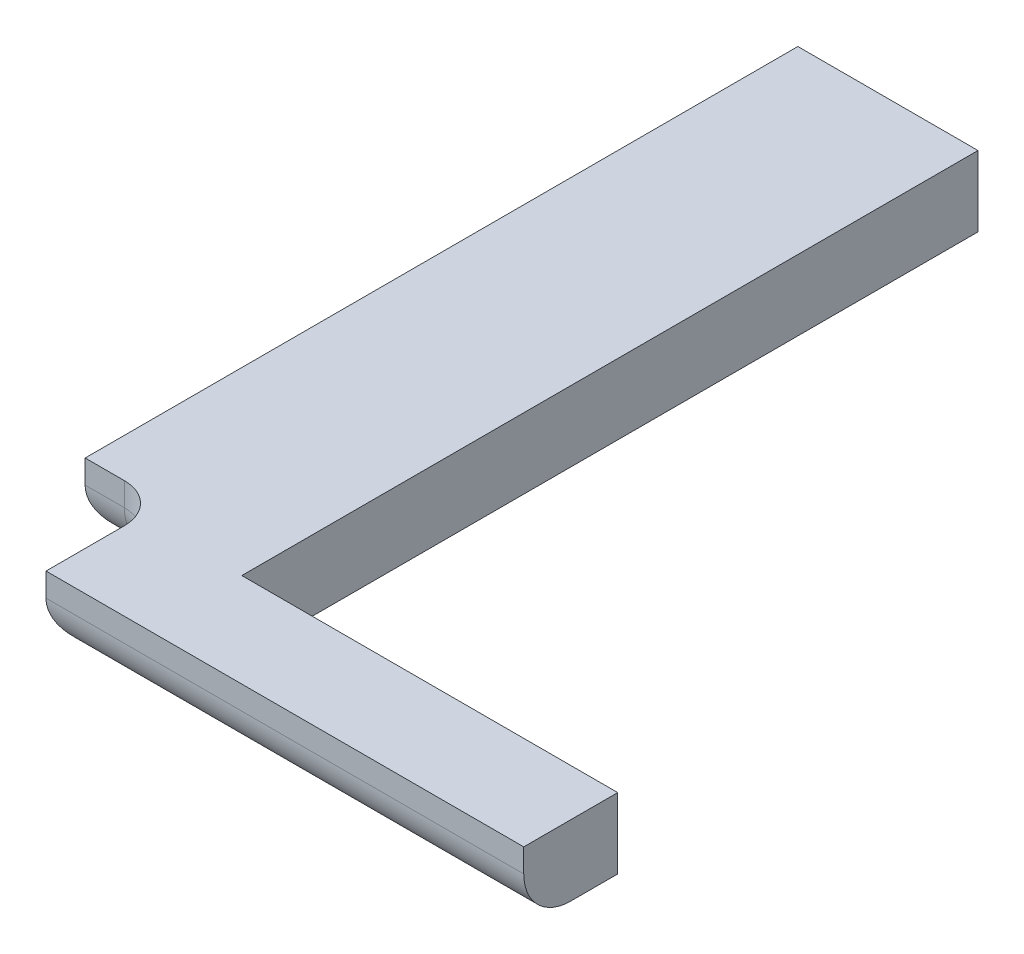
ISO-10303-21;
HEADER;
FILE_DESCRIPTION(('STEP AP214'),'2;1');
FILE_NAME('part.step','',(''),(''),'','','');
FILE_SCHEMA(('AUTOMOTIVE_DESIGN { 1 0 10303 214 1 1 1 1 }'));
ENDSEC;
DATA;
#1=APPLICATION_CONTEXT('core data for automotive mechanical design processes');
#2=APPLICATION_PROTOCOL_DEFINITION('international standard','automotive_design',2000,#1);
#3=PRODUCT_CONTEXT('',#1,'mechanical');
#4=PRODUCT('Part','Part','',(#3));
#5=PRODUCT_RELATED_PRODUCT_CATEGORY('part','',(#4));
#6=PRODUCT_DEFINITION_FORMATION('','',#4);
#7=PRODUCT_DEFINITION_CONTEXT('part definition',#1,'design');
#8=PRODUCT_DEFINITION('design','',#6,#7);
#9=PRODUCT_DEFINITION_SHAPE('','',#8);
#10=(LENGTH_UNIT() NAMED_UNIT(*) SI_UNIT(.MILLI.,.METRE.));
#11=(NAMED_UNIT(*) PLANE_ANGLE_UNIT() SI_UNIT($,.RADIAN.));
#12=(NAMED_UNIT(*) SI_UNIT($,.STERADIAN.) SOLID_ANGLE_UNIT());
#13=UNCERTAINTY_MEASURE_WITH_UNIT(LENGTH_MEASURE(1.E-05),#10,'distance_accuracy_value','');
#14=(GEOMETRIC_REPRESENTATION_CONTEXT(3) GLOBAL_UNCERTAINTY_ASSIGNED_CONTEXT((#13)) GLOBAL_UNIT_ASSIGNED_CONTEXT((#10,
#11,#12)) REPRESENTATION_CONTEXT('',''));
#15=CARTESIAN_POINT('',(0.,0.,0.));
#16=DIRECTION('',(0.,0.,1.));
#17=DIRECTION('',(1.,0.,0.));
#18=AXIS2_PLACEMENT_3D('',#15,#16,#17);
#19=CARTESIAN_POINT('',(0.,9.,12.));
#20=DIRECTION('',(-1.,0.,0.));
#21=DIRECTION('',(0.,0.,1.));
#22=AXIS2_PLACEMENT_3D('',#19,#20,#21);
#23=PLANE('',#22);
#24=DIRECTION('',(0.,-1.,0.));
#25=VECTOR('',#24,1.);
#26=CARTESIAN_POINT('',(0.,9.,12.));
#27=LINE('',#26,#25);
#28=CARTESIAN_POINT('',(0.,9.,12.));
#29=VERTEX_POINT('',#28);
#30=CARTESIAN_POINT('',(0.,6.,12.));
#31=VERTEX_POINT('',#30);
#32=EDGE_CURVE('E265',#29,#31,#27,.T.);
#33=ORIENTED_EDGE('',*,*,#32,.T.);
#34=CARTESIAN_POINT('',(0.,6.,6.));
#35=DIRECTION('',(-1.,0.,0.));
#36=DIRECTION('',(0.,0.,1.));
#37=AXIS2_PLACEMENT_3D('',#34,#35,#36);
#38=CIRCLE('',#37,6.);
#39=CARTESIAN_POINT('',(0.,0.,6.));
#40=VERTEX_POINT('',#39);
#41=EDGE_CURVE('E146',#31,#40,#38,.F.);
#42=ORIENTED_EDGE('',*,*,#41,.T.);
#43=DIRECTION('',(0.,0.,-1.));
#44=VECTOR('',#43,1.);
#45=CARTESIAN_POINT('',(0.,0.,12.));
#46=LINE('',#45,#44);
#47=CARTESIAN_POINT('',(0.,0.,0.));
#48=VERTEX_POINT('',#47);
#49=EDGE_CURVE('E141',#40,#48,#46,.T.);
#50=ORIENTED_EDGE('',*,*,#49,.T.);
#51=DIRECTION('',(0.,-1.,0.));
#52=VECTOR('',#51,1.);
#53=CARTESIAN_POINT('',(0.,9.,0.));
#54=LINE('',#53,#52);
#55=CARTESIAN_POINT('',(0.,9.,0.));
#56=VERTEX_POINT('',#55);
#57=EDGE_CURVE('E123',#56,#48,#54,.T.);
#58=ORIENTED_EDGE('',*,*,#57,.F.);
#59=DIRECTION('',(0.,0.,-1.));
#60=VECTOR('',#59,1.);
#61=CARTESIAN_POINT('',(0.,9.,12.));
#62=LINE('',#61,#60);
#63=EDGE_CURVE('E129',#29,#56,#62,.T.);
#64=ORIENTED_EDGE('',*,*,#63,.F.);
#65=EDGE_LOOP('',(#33,#42,#50,#58,#64));
#66=FACE_BOUND('',#65,.T.);
#67=ADVANCED_FACE('F33',(#66),#23,.F.);
#68=CARTESIAN_POINT('',(0.,9.,0.));
#69=DIRECTION('',(0.,0.,1.));
#70=DIRECTION('',(1.,0.,0.));
#71=AXIS2_PLACEMENT_3D('',#68,#69,#70);
#72=PLANE('',#71);
#73=DIRECTION('',(-1.,0.,0.));
#74=VECTOR('',#73,1.);
#75=CARTESIAN_POINT('',(0.,0.,0.));
#76=LINE('',#75,#74);
#77=CARTESIAN_POINT('',(-48.,0.,0.));
#78=VERTEX_POINT('',#77);
#79=EDGE_CURVE('E261',#48,#78,#76,.T.);
#80=ORIENTED_EDGE('',*,*,#79,.T.);
#81=DIRECTION('',(0.,-1.,0.));
#82=VECTOR('',#81,1.);
#83=CARTESIAN_POINT('',(-48.,9.,0.));
#84=LINE('',#83,#82);
#85=CARTESIAN_POINT('',(-48.,9.,0.));
#86=VERTEX_POINT('',#85);
#87=EDGE_CURVE('E125',#86,#78,#84,.T.);
#88=ORIENTED_EDGE('',*,*,#87,.F.);
#89=DIRECTION('',(-1.,0.,0.));
#90=VECTOR('',#89,1.);
#91=CARTESIAN_POINT('',(0.,9.,0.));
#92=LINE('',#91,#90);
#93=EDGE_CURVE('E119',#56,#86,#92,.T.);
#94=ORIENTED_EDGE('',*,*,#93,.F.);
#95=ORIENTED_EDGE('',*,*,#57,.T.);
#96=EDGE_LOOP('',(#80,#88,#94,#95));
#97=FACE_BOUND('',#96,.T.);
#98=ADVANCED_FACE('F121',(#97),#72,.F.);
#99=CARTESIAN_POINT('',(-48.,9.,0.));
#100=DIRECTION('',(-1.,0.,0.));
#101=DIRECTION('',(0.,0.,1.));
#102=AXIS2_PLACEMENT_3D('',#99,#100,#101);
#103=PLANE('',#102);
#104=DIRECTION('',(0.,0.,-1.));
#105=VECTOR('',#104,1.);
#106=CARTESIAN_POINT('',(-48.,0.,0.));
#107=LINE('',#106,#105);
#108=CARTESIAN_POINT('',(-48.,0.,-94.));
#109=VERTEX_POINT('',#108);
#110=EDGE_CURVE('E259',#78,#109,#107,.T.);
#111=ORIENTED_EDGE('',*,*,#110,.T.);
#112=DIRECTION('',(0.,-1.,0.));
#113=VECTOR('',#112,1.);
#114=CARTESIAN_POINT('',(-48.,9.,-94.));
#115=LINE('',#114,#113);
#116=CARTESIAN_POINT('',(-48.,9.,-94.));
#117=VERTEX_POINT('',#116);
#118=EDGE_CURVE('E148',#117,#109,#115,.T.);
#119=ORIENTED_EDGE('',*,*,#118,.F.);
#120=DIRECTION('',(0.,0.,-1.));
#121=VECTOR('',#120,1.);
#122=CARTESIAN_POINT('',(-48.,9.,0.));
#123=LINE('',#122,#121);
#124=EDGE_CURVE('E128',#86,#117,#123,.T.);
#125=ORIENTED_EDGE('',*,*,#124,.F.);
#126=ORIENTED_EDGE('',*,*,#87,.T.);
#127=EDGE_LOOP('',(#111,#119,#125,#126));
#128=FACE_BOUND('',#127,.T.);
#129=ADVANCED_FACE('F205',(#128),#103,.F.);
#130=CARTESIAN_POINT('',(-48.,9.,-94.));
#131=DIRECTION('',(0.,0.,1.));
#132=DIRECTION('',(1.,0.,0.));
#133=AXIS2_PLACEMENT_3D('',#130,#131,#132);
#134=PLANE('',#133);
#135=DIRECTION('',(-1.,0.,0.));
#136=VECTOR('',#135,1.);
#137=CARTESIAN_POINT('',(-48.,0.,-94.));
#138=LINE('',#137,#136);
#139=CARTESIAN_POINT('',(-65.,0.,-94.));
#140=VERTEX_POINT('',#139);
#141=EDGE_CURVE('E138',#109,#140,#138,.T.);
#142=ORIENTED_EDGE('',*,*,#141,.T.);
#143=CARTESIAN_POINT('',(-65.,6.,-94.));
#144=DIRECTION('',(0.,0.,1.));
#145=DIRECTION('',(1.,0.,0.));
#146=AXIS2_PLACEMENT_3D('',#143,#144,#145);
#147=CIRCLE('',#146,6.);
#148=CARTESIAN_POINT('',(-71.,6.,-94.));
#149=VERTEX_POINT('',#148);
#150=EDGE_CURVE('E11',#140,#149,#147,.F.);
#151=ORIENTED_EDGE('',*,*,#150,.T.);
#152=DIRECTION('',(0.,-1.,0.));
#153=VECTOR('',#152,1.);
#154=CARTESIAN_POINT('',(-71.,9.,-94.));
#155=LINE('',#154,#153);
#156=CARTESIAN_POINT('',(-71.,9.,-94.));
#157=VERTEX_POINT('',#156);
#158=EDGE_CURVE('E240',#157,#149,#155,.T.);
#159=ORIENTED_EDGE('',*,*,#158,.F.);
#160=DIRECTION('',(-1.,0.,0.));
#161=VECTOR('',#160,1.);
#162=CARTESIAN_POINT('',(-48.,9.,-94.));
#163=LINE('',#162,#161);
#164=EDGE_CURVE('E256',#117,#157,#163,.T.);
#165=ORIENTED_EDGE('',*,*,#164,.F.);
#166=ORIENTED_EDGE('',*,*,#118,.T.);
#167=EDGE_LOOP('',(#142,#151,#159,#165,#166));
#168=FACE_BOUND('',#167,.T.);
#169=ADVANCED_FACE('F255',(#168),#134,.F.);
#170=CARTESIAN_POINT('',(-71.,9.,-94.));
#171=DIRECTION('',(1.,0.,0.));
#172=DIRECTION('',(0.,0.,-1.));
#173=AXIS2_PLACEMENT_3D('',#170,#171,#172);
#174=PLANE('',#173);
#175=ORIENTED_EDGE('',*,*,#158,.T.);
#176=DIRECTION('',(0.,0.,1.));
#177=VECTOR('',#176,1.);
#178=CARTESIAN_POINT('',(-71.,6.,-3.));
#179=LINE('',#178,#177);
#180=CARTESIAN_POINT('',(-71.,6.,-3.));
#181=VERTEX_POINT('',#180);
#182=EDGE_CURVE('E43',#149,#181,#179,.T.);
#183=ORIENTED_EDGE('',*,*,#182,.T.);
#184=DIRECTION('',(0.,-1.,0.));
#185=VECTOR('',#184,1.);
#186=CARTESIAN_POINT('',(-71.,9.,-3.));
#187=LINE('',#186,#185);
#188=CARTESIAN_POINT('',(-71.,9.,-3.));
#189=VERTEX_POINT('',#188);
#190=EDGE_CURVE('E238',#189,#181,#187,.T.);
#191=ORIENTED_EDGE('',*,*,#190,.F.);
#192=DIRECTION('',(0.,0.,1.));
#193=VECTOR('',#192,1.);
#194=CARTESIAN_POINT('',(-71.,9.,-94.));
#195=LINE('',#194,#193);
#196=EDGE_CURVE('E287',#157,#189,#195,.T.);
#197=ORIENTED_EDGE('',*,*,#196,.F.);
#198=EDGE_LOOP('',(#175,#183,#191,#197));
#199=FACE_BOUND('',#198,.T.);
#200=ADVANCED_FACE('F236',(#199),#174,.F.);
#201=CARTESIAN_POINT('',(-71.,9.,-3.));
#202=DIRECTION('',(0.,0.,-1.));
#203=DIRECTION('',(-1.,0.,0.));
#204=AXIS2_PLACEMENT_3D('',#201,#202,#203);
#205=PLANE('',#204);
#206=ORIENTED_EDGE('',*,*,#190,.T.);
#207=DIRECTION('',(1.,0.,0.));
#208=VECTOR('',#207,1.);
#209=CARTESIAN_POINT('',(-61.,6.,-3.));
#210=LINE('',#209,#208);
#211=CARTESIAN_POINT('',(-66.,6.,-3.));
#212=VERTEX_POINT('',#211);
#213=EDGE_CURVE('E163',#181,#212,#210,.T.);
#214=ORIENTED_EDGE('',*,*,#213,.T.);
#215=DIRECTION('',(0.,-1.,0.));
#216=VECTOR('',#215,1.);
#217=CARTESIAN_POINT('',(-66.,9.,-3.));
#218=LINE('',#217,#216);
#219=CARTESIAN_POINT('',(-66.,9.,-3.));
#220=VERTEX_POINT('',#219);
#221=EDGE_CURVE('E246',#220,#212,#218,.T.);
#222=ORIENTED_EDGE('',*,*,#221,.F.);
#223=DIRECTION('',(1.,0.,0.));
#224=VECTOR('',#223,1.);
#225=CARTESIAN_POINT('',(-71.,9.,-3.));
#226=LINE('',#225,#224);
#227=EDGE_CURVE('E245',#189,#220,#226,.T.);
#228=ORIENTED_EDGE('',*,*,#227,.F.);
#229=EDGE_LOOP('',(#206,#214,#222,#228));
#230=FACE_BOUND('',#229,.T.);
#231=ADVANCED_FACE('F242',(#230),#205,.F.);
#232=CARTESIAN_POINT('',(-66.,9.,2.));
#233=DIRECTION('',(0.,-1.,0.));
#234=DIRECTION('',(0.,0.,-1.));
#235=AXIS2_PLACEMENT_3D('',#232,#233,#234);
#236=CYLINDRICAL_SURFACE('',#235,5.);
#237=ORIENTED_EDGE('',*,*,#221,.T.);
#238=CARTESIAN_POINT('',(-66.,6.,2.));
#239=DIRECTION('',(0.,-1.,0.));
#240=DIRECTION('',(0.,0.,-1.));
#241=AXIS2_PLACEMENT_3D('',#238,#239,#240);
#242=CIRCLE('',#241,5.);
#243=CARTESIAN_POINT('',(-61.,6.,2.));
#244=VERTEX_POINT('',#243);
#245=EDGE_CURVE('E165',#212,#244,#242,.T.);
#246=ORIENTED_EDGE('',*,*,#245,.T.);
#247=DIRECTION('',(0.,-1.,0.));
#248=VECTOR('',#247,1.);
#249=CARTESIAN_POINT('',(-61.,9.,2.));
#250=LINE('',#249,#248);
#251=CARTESIAN_POINT('',(-61.,9.,2.));
#252=VERTEX_POINT('',#251);
#253=EDGE_CURVE('E249',#252,#244,#250,.T.);
#254=ORIENTED_EDGE('',*,*,#253,.F.);
#255=CARTESIAN_POINT('',(-66.,9.,2.));
#256=DIRECTION('',(0.,-1.,0.));
#257=DIRECTION('',(0.,0.,-1.));
#258=AXIS2_PLACEMENT_3D('',#255,#256,#257);
#259=CIRCLE('',#258,5.);
#260=EDGE_CURVE('E279',#220,#252,#259,.T.);
#261=ORIENTED_EDGE('',*,*,#260,.F.);
#262=EDGE_LOOP('',(#237,#246,#254,#261));
#263=FACE_BOUND('',#262,.T.);
#264=ADVANCED_FACE('F278',(#263),#236,.F.);
#265=CARTESIAN_POINT('',(-61.,9.,2.));
#266=DIRECTION('',(1.,0.,0.));
#267=DIRECTION('',(0.,0.,-1.));
#268=AXIS2_PLACEMENT_3D('',#265,#266,#267);
#269=PLANE('',#268);
#270=ORIENTED_EDGE('',*,*,#253,.T.);
#271=DIRECTION('',(0.,0.,1.));
#272=VECTOR('',#271,1.);
#273=CARTESIAN_POINT('',(-61.,6.,12.));
#274=LINE('',#273,#272);
#275=CARTESIAN_POINT('',(-61.,6.,12.));
#276=VERTEX_POINT('',#275);
#277=EDGE_CURVE('E161',#244,#276,#274,.T.);
#278=ORIENTED_EDGE('',*,*,#277,.T.);
#279=DIRECTION('',(0.,-1.,0.));
#280=VECTOR('',#279,1.);
#281=CARTESIAN_POINT('',(-61.,9.,12.));
#282=LINE('',#281,#280);
#283=CARTESIAN_POINT('',(-61.,9.,12.));
#284=VERTEX_POINT('',#283);
#285=EDGE_CURVE('E267',#284,#276,#282,.T.);
#286=ORIENTED_EDGE('',*,*,#285,.F.);
#287=DIRECTION('',(0.,0.,1.));
#288=VECTOR('',#287,1.);
#289=CARTESIAN_POINT('',(-61.,9.,2.));
#290=LINE('',#289,#288);
#291=EDGE_CURVE('E275',#252,#284,#290,.T.);
#292=ORIENTED_EDGE('',*,*,#291,.F.);
#293=EDGE_LOOP('',(#270,#278,#286,#292));
#294=FACE_BOUND('',#293,.T.);
#295=ADVANCED_FACE('F273',(#294),#269,.F.);
#296=CARTESIAN_POINT('',(-61.,9.,12.));
#297=DIRECTION('',(0.,0.,-1.));
#298=DIRECTION('',(-1.,0.,0.));
#299=AXIS2_PLACEMENT_3D('',#296,#297,#298);
#300=PLANE('',#299);
#301=ORIENTED_EDGE('',*,*,#285,.T.);
#302=DIRECTION('',(1.,0.,0.));
#303=VECTOR('',#302,1.);
#304=CARTESIAN_POINT('',(0.,6.,12.));
#305=LINE('',#304,#303);
#306=EDGE_CURVE('E143',#276,#31,#305,.T.);
#307=ORIENTED_EDGE('',*,*,#306,.T.);
#308=ORIENTED_EDGE('',*,*,#32,.F.);
#309=DIRECTION('',(1.,0.,0.));
#310=VECTOR('',#309,1.);
#311=CARTESIAN_POINT('',(-61.,9.,12.));
#312=LINE('',#311,#310);
#313=EDGE_CURVE('E134',#284,#29,#312,.T.);
#314=ORIENTED_EDGE('',*,*,#313,.F.);
#315=EDGE_LOOP('',(#301,#307,#308,#314));
#316=FACE_BOUND('',#315,.T.);
#317=ADVANCED_FACE('F325',(#316),#300,.F.);
#318=CARTESIAN_POINT('',(-66.,9.,2.));
#319=DIRECTION('',(0.,-1.,0.));
#320=DIRECTION('',(0.,0.,-1.));
#321=AXIS2_PLACEMENT_3D('',#318,#319,#320);
#322=PLANE('',#321);
#323=ORIENTED_EDGE('',*,*,#63,.T.);
#324=ORIENTED_EDGE('',*,*,#93,.T.);
#325=ORIENTED_EDGE('',*,*,#124,.T.);
#326=ORIENTED_EDGE('',*,*,#164,.T.);
#327=ORIENTED_EDGE('',*,*,#196,.T.);
#328=ORIENTED_EDGE('',*,*,#227,.T.);
#329=ORIENTED_EDGE('',*,*,#260,.T.);
#330=ORIENTED_EDGE('',*,*,#291,.T.);
#331=ORIENTED_EDGE('',*,*,#313,.T.);
#332=EDGE_LOOP('',(#323,#324,#325,#326,#327,#328,#329,#330,#331));
#333=FACE_BOUND('',#332,.T.);
#334=ADVANCED_FACE('F132',(#333),#322,.F.);
#335=CARTESIAN_POINT('',(-66.,0.,2.));
#336=DIRECTION('',(0.,-1.,0.));
#337=DIRECTION('',(0.,0.,-1.));
#338=AXIS2_PLACEMENT_3D('',#335,#336,#337);
#339=PLANE('',#338);
#340=CARTESIAN_POINT('',(-56.,0.,-84.));
#341=DIRECTION('',(0.,-1.,0.));
#342=DIRECTION('',(0.,0.,-1.));
#343=AXIS2_PLACEMENT_3D('',#340,#341,#342);
#344=CIRCLE('',#343,6.);
#345=CARTESIAN_POINT('',(-56.,0.,-90.));
#346=VERTEX_POINT('',#345);
#347=EDGE_CURVE('E297',#346,#346,#344,.T.);
#348=ORIENTED_EDGE('',*,*,#347,.F.);
#349=EDGE_LOOP('',(#348));
#350=FACE_BOUND('',#349,.T.);
#351=CARTESIAN_POINT('',(-56.,0.,-64.));
#352=DIRECTION('',(0.,-1.,0.));
#353=DIRECTION('',(0.,0.,-1.));
#354=AXIS2_PLACEMENT_3D('',#351,#352,#353);
#355=CIRCLE('',#354,6.);
#356=CARTESIAN_POINT('',(-56.,0.,-70.));
#357=VERTEX_POINT('',#356);
#358=EDGE_CURVE('E291',#357,#357,#355,.T.);
#359=ORIENTED_EDGE('',*,*,#358,.F.);
#360=EDGE_LOOP('',(#359));
#361=FACE_BOUND('',#360,.T.);
#362=ORIENTED_EDGE('',*,*,#49,.F.);
#363=DIRECTION('',(1.,0.,0.));
#364=VECTOR('',#363,1.);
#365=CARTESIAN_POINT('',(-61.,0.,6.));
#366=LINE('',#365,#364);
#367=CARTESIAN_POINT('',(-55.,0.,6.));
#368=VERTEX_POINT('',#367);
#369=EDGE_CURVE('E159',#40,#368,#366,.F.);
#370=ORIENTED_EDGE('',*,*,#369,.T.);
#371=DIRECTION('',(0.,0.,1.));
#372=VECTOR('',#371,1.);
#373=CARTESIAN_POINT('',(-55.,0.,2.));
#374=LINE('',#373,#372);
#375=CARTESIAN_POINT('',(-55.,0.,2.));
#376=VERTEX_POINT('',#375);
#377=EDGE_CURVE('E157',#368,#376,#374,.F.);
#378=ORIENTED_EDGE('',*,*,#377,.T.);
#379=CARTESIAN_POINT('',(-66.,0.,2.));
#380=DIRECTION('',(0.,-1.,0.));
#381=DIRECTION('',(0.,0.,-1.));
#382=AXIS2_PLACEMENT_3D('',#379,#380,#381);
#383=CIRCLE('',#382,11.);
#384=CARTESIAN_POINT('',(-65.,0.,-8.95445115010332));
#385=VERTEX_POINT('',#384);
#386=EDGE_CURVE('E155',#376,#385,#383,.F.);
#387=ORIENTED_EDGE('',*,*,#386,.T.);
#388=DIRECTION('',(0.,0.,1.));
#389=VECTOR('',#388,1.);
#390=CARTESIAN_POINT('',(-65.,0.,-94.));
#391=LINE('',#390,#389);
#392=EDGE_CURVE('E153',#385,#140,#391,.F.);
#393=ORIENTED_EDGE('',*,*,#392,.T.);
#394=ORIENTED_EDGE('',*,*,#141,.F.);
#395=ORIENTED_EDGE('',*,*,#110,.F.);
#396=ORIENTED_EDGE('',*,*,#79,.F.);
#397=EDGE_LOOP('',(#362,#370,#378,#387,#393,#394,#395,#396));
#398=FACE_BOUND('',#397,.T.);
#399=ADVANCED_FACE('F189',(#350,#361,#398),#339,.T.);
#400=CARTESIAN_POINT('',(-65.,6.,-94.));
#401=DIRECTION('',(0.,0.,-1.));
#402=DIRECTION('',(-1.,0.,0.));
#403=AXIS2_PLACEMENT_3D('',#400,#401,#402);
#404=CYLINDRICAL_SURFACE('',#403,6.);
#405=CARTESIAN_POINT('',(-65.,6.,-9.));
#406=DIRECTION('',(-0.707106781186548,0.,-0.707106781186547));
#407=DIRECTION('',(0.707106781186547,0.,-0.707106781186548));
#408=AXIS2_PLACEMENT_3D('',#405,#406,#407);
#409=ELLIPSE('',#408,8.48528137423857,6.);
#410=CARTESIAN_POINT('',(-66.,0.0839202169003843,-7.99999999999999));
#411=VERTEX_POINT('',#410);
#412=EDGE_CURVE('E37',#181,#411,#409,.F.);
#413=ORIENTED_EDGE('',*,*,#412,.F.);
#414=ORIENTED_EDGE('',*,*,#182,.F.);
#415=ORIENTED_EDGE('',*,*,#150,.F.);
#416=ORIENTED_EDGE('',*,*,#392,.F.);
#417=CARTESIAN_POINT('',(-66.,0.0839202169003843,-7.99999999999999));
#418=CARTESIAN_POINT('',(-65.7312956317891,0.0385069745095071,-8.26872735809804));
#419=CARTESIAN_POINT('',(-65.4557879465511,0.0107629331039343,-8.53336412427679));
#420=CARTESIAN_POINT('',(-65.1209081882709,0.000970955422316308,-8.84363310663395));
#421=CARTESIAN_POINT('',(-65.066271378058,0.000115654360453228,-8.89390106239372));
#422=CARTESIAN_POINT('',(-65.0076427144854,3.65187896827806E-06,-8.9474726721671));
#423=CARTESIAN_POINT('',(-65.003821772076,4.29184426437478E-10,-8.95096236612994));
#424=CARTESIAN_POINT('',(-65.,0.,-8.95445115010332));
#425=B_SPLINE_CURVE_WITH_KNOTS('',3,(#417,#418,#419,#420,#421,#422,#423,#424),.UNSPECIFIED.,.F.,
.F.,(4,2,2,4),(0.,1.14707936905922,1.36980975958521,1.38533387176109),.UNSPECIFIED.);
#426=EDGE_CURVE('E177',#411,#385,#425,.T.);
#427=ORIENTED_EDGE('',*,*,#426,.F.);
#428=EDGE_LOOP('',(#413,#414,#415,#416,#427));
#429=FACE_BOUND('',#428,.T.);
#430=ADVANCED_FACE('F186',(#429),#404,.T.);
#431=CARTESIAN_POINT('',(-71.,6.,-9.));
#432=DIRECTION('',(-1.,0.,0.));
#433=DIRECTION('',(0.,0.,1.));
#434=AXIS2_PLACEMENT_3D('',#431,#432,#433);
#435=CYLINDRICAL_SURFACE('',#434,6.);
#436=ORIENTED_EDGE('',*,*,#213,.F.);
#437=ORIENTED_EDGE('',*,*,#412,.T.);
#438=CARTESIAN_POINT('',(-66.,6.,-9.));
#439=DIRECTION('',(1.,0.,0.));
#440=DIRECTION('',(0.,0.,-1.));
#441=AXIS2_PLACEMENT_3D('',#438,#439,#440);
#442=CIRCLE('',#441,6.);
#443=EDGE_CURVE('E175',#212,#411,#442,.T.);
#444=ORIENTED_EDGE('',*,*,#443,.F.);
#445=EDGE_LOOP('',(#436,#437,#444));
#446=FACE_BOUND('',#445,.T.);
#447=ADVANCED_FACE('F35',(#446),#435,.T.);
#448=CARTESIAN_POINT('',(-66.,6.,2.));
#449=DIRECTION('',(0.,-1.,0.));
#450=DIRECTION('',(0.,0.,-1.));
#451=AXIS2_PLACEMENT_3D('',#448,#449,#450);
#452=TOROIDAL_SURFACE('',#451,11.,6.);
#453=ORIENTED_EDGE('',*,*,#426,.T.);
#454=ORIENTED_EDGE('',*,*,#386,.F.);
#455=CARTESIAN_POINT('',(-55.,6.,2.));
#456=DIRECTION('',(0.,0.,1.));
#457=DIRECTION('',(1.,0.,0.));
#458=AXIS2_PLACEMENT_3D('',#455,#456,#457);
#459=CIRCLE('',#458,6.);
#460=EDGE_CURVE('E171',#244,#376,#459,.T.);
#461=ORIENTED_EDGE('',*,*,#460,.F.);
#462=ORIENTED_EDGE('',*,*,#245,.F.);
#463=ORIENTED_EDGE('',*,*,#443,.T.);
#464=EDGE_LOOP('',(#453,#454,#461,#462,#463));
#465=FACE_BOUND('',#464,.T.);
#466=ADVANCED_FACE('F183',(#465),#452,.T.);
#467=CARTESIAN_POINT('',(-55.,6.,2.));
#468=DIRECTION('',(0.,0.,-1.));
#469=DIRECTION('',(-1.,0.,0.));
#470=AXIS2_PLACEMENT_3D('',#467,#468,#469);
#471=CYLINDRICAL_SURFACE('',#470,6.);
#472=ORIENTED_EDGE('',*,*,#460,.T.);
#473=ORIENTED_EDGE('',*,*,#377,.F.);
#474=CARTESIAN_POINT('',(-55.,6.,6.));
#475=DIRECTION('',(-0.707106781186547,0.,-0.707106781186547));
#476=DIRECTION('',(0.707106781186547,0.,-0.707106781186547));
#477=AXIS2_PLACEMENT_3D('',#474,#475,#476);
#478=ELLIPSE('',#477,8.48528137423857,6.);
#479=EDGE_CURVE('E168',#276,#368,#478,.F.);
#480=ORIENTED_EDGE('',*,*,#479,.F.);
#481=ORIENTED_EDGE('',*,*,#277,.F.);
#482=EDGE_LOOP('',(#472,#473,#480,#481));
#483=FACE_BOUND('',#482,.T.);
#484=ADVANCED_FACE('F212',(#483),#471,.T.);
#485=CARTESIAN_POINT('',(-61.,6.,6.));
#486=DIRECTION('',(-1.,0.,0.));
#487=DIRECTION('',(0.,0.,1.));
#488=AXIS2_PLACEMENT_3D('',#485,#486,#487);
#489=CYLINDRICAL_SURFACE('',#488,6.);
#490=ORIENTED_EDGE('',*,*,#479,.T.);
#491=ORIENTED_EDGE('',*,*,#369,.F.);
#492=ORIENTED_EDGE('',*,*,#41,.F.);
#493=ORIENTED_EDGE('',*,*,#306,.F.);
#494=EDGE_LOOP('',(#490,#491,#492,#493));
#495=FACE_BOUND('',#494,.T.);
#496=ADVANCED_FACE('F209',(#495),#489,.T.);
#497=CARTESIAN_POINT('',(-56.,3.,-64.));
#498=DIRECTION('',(0.,-1.,0.));
#499=DIRECTION('',(0.,0.,-1.));
#500=AXIS2_PLACEMENT_3D('',#497,#498,#499);
#501=CYLINDRICAL_SURFACE('',#500,6.);
#502=CARTESIAN_POINT('',(-56.,3.,-64.));
#503=DIRECTION('',(0.,-1.,0.));
#504=DIRECTION('',(0.,0.,-1.));
#505=AXIS2_PLACEMENT_3D('',#502,#503,#504);
#506=CIRCLE('',#505,6.);
#507=CARTESIAN_POINT('',(-56.,3.,-70.));
#508=VERTEX_POINT('',#507);
#509=EDGE_CURVE('E294',#508,#508,#506,.T.);
#510=ORIENTED_EDGE('',*,*,#509,.F.);
#511=EDGE_LOOP('',(#510));
#512=FACE_BOUND('',#511,.T.);
#513=ORIENTED_EDGE('',*,*,#358,.T.);
#514=EDGE_LOOP('',(#513));
#515=FACE_BOUND('',#514,.T.);
#516=ADVANCED_FACE('F211',(#512,#515),#501,.F.);
#517=CARTESIAN_POINT('',(-56.,3.,-64.));
#518=DIRECTION('',(0.,-1.,0.));
#519=DIRECTION('',(0.,0.,-1.));
#520=AXIS2_PLACEMENT_3D('',#517,#518,#519);
#521=PLANE('',#520);
#522=ORIENTED_EDGE('',*,*,#509,.T.);
#523=EDGE_LOOP('',(#522));
#524=FACE_BOUND('',#523,.T.);
#525=ADVANCED_FACE('F308',(#524),#521,.T.);
#526=CARTESIAN_POINT('',(-56.,3.,-84.));
#527=DIRECTION('',(0.,-1.,0.));
#528=DIRECTION('',(0.,0.,-1.));
#529=AXIS2_PLACEMENT_3D('',#526,#527,#528);
#530=CYLINDRICAL_SURFACE('',#529,6.);
#531=CARTESIAN_POINT('',(-56.,3.,-84.));
#532=DIRECTION('',(0.,-1.,0.));
#533=DIRECTION('',(0.,0.,-1.));
#534=AXIS2_PLACEMENT_3D('',#531,#532,#533);
#535=CIRCLE('',#534,6.);
#536=CARTESIAN_POINT('',(-56.,3.,-90.));
#537=VERTEX_POINT('',#536);
#538=EDGE_CURVE('E172',#537,#537,#535,.T.);
#539=ORIENTED_EDGE('',*,*,#538,.F.);
#540=EDGE_LOOP('',(#539));
#541=FACE_BOUND('',#540,.T.);
#542=ORIENTED_EDGE('',*,*,#347,.T.);
#543=EDGE_LOOP('',(#542));
#544=FACE_BOUND('',#543,.T.);
#545=ADVANCED_FACE('F305',(#541,#544),#530,.F.);
#546=CARTESIAN_POINT('',(-56.,3.,-84.));
#547=DIRECTION('',(0.,-1.,0.));
#548=DIRECTION('',(0.,0.,-1.));
#549=AXIS2_PLACEMENT_3D('',#546,#547,#548);
#550=PLANE('',#549);
#551=ORIENTED_EDGE('',*,*,#538,.T.);
#552=EDGE_LOOP('',(#551));
#553=FACE_BOUND('',#552,.T.);
#554=ADVANCED_FACE('F303',(#553),#550,.T.);
#555=CLOSED_SHELL('',(#67,#98,#129,#169,#200,#231,#264,#295,#317,#334,#399,#430,#447,#466,#484,
#496,#516,#525,#545,#554));
#556=MANIFOLD_SOLID_BREP('B2',#555);
#557=ADVANCED_BREP_SHAPE_REPRESENTATION('',(#18,#556),#14);
#558=SHAPE_DEFINITION_REPRESENTATION(#9,#557);
ENDSEC;
END-ISO-10303-21;
